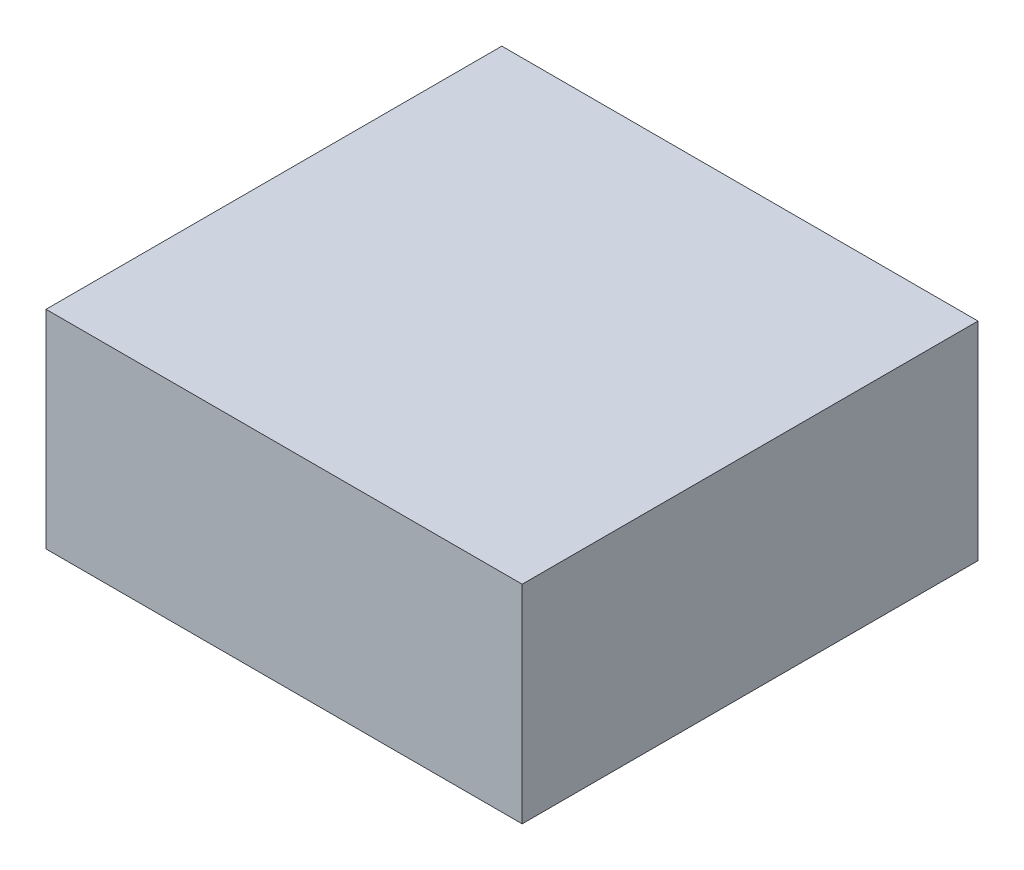
ISO-10303-21;
HEADER;
FILE_DESCRIPTION(('STEP AP214'),'2;1');
FILE_NAME('part.step','',(''),(''),'','','');
FILE_SCHEMA(('AUTOMOTIVE_DESIGN { 1 0 10303 214 1 1 1 1 }'));
ENDSEC;
DATA;
#1=APPLICATION_CONTEXT('core data for automotive mechanical design processes');
#2=APPLICATION_PROTOCOL_DEFINITION('international standard','automotive_design',2000,#1);
#3=PRODUCT_CONTEXT('',#1,'mechanical');
#4=PRODUCT('Part','Part','',(#3));
#5=PRODUCT_RELATED_PRODUCT_CATEGORY('part','',(#4));
#6=PRODUCT_DEFINITION_FORMATION('','',#4);
#7=PRODUCT_DEFINITION_CONTEXT('part definition',#1,'design');
#8=PRODUCT_DEFINITION('design','',#6,#7);
#9=PRODUCT_DEFINITION_SHAPE('','',#8);
#10=(LENGTH_UNIT() NAMED_UNIT(*) SI_UNIT(.MILLI.,.METRE.));
#11=(NAMED_UNIT(*) PLANE_ANGLE_UNIT() SI_UNIT($,.RADIAN.));
#12=(NAMED_UNIT(*) SI_UNIT($,.STERADIAN.) SOLID_ANGLE_UNIT());
#13=UNCERTAINTY_MEASURE_WITH_UNIT(LENGTH_MEASURE(1.E-05),#10,'distance_accuracy_value','');
#14=(GEOMETRIC_REPRESENTATION_CONTEXT(3) GLOBAL_UNCERTAINTY_ASSIGNED_CONTEXT((#13)) GLOBAL_UNIT_ASSIGNED_CONTEXT((#10,
#11,#12)) REPRESENTATION_CONTEXT('',''));
#15=CARTESIAN_POINT('',(0.,0.,0.));
#16=DIRECTION('',(0.,0.,1.));
#17=DIRECTION('',(1.,0.,0.));
#18=AXIS2_PLACEMENT_3D('',#15,#16,#17);
#19=CARTESIAN_POINT('',(58.5,-25.5,56.));
#20=DIRECTION('',(-1.,0.,0.));
#21=DIRECTION('',(0.,0.,1.));
#22=AXIS2_PLACEMENT_3D('',#19,#20,#21);
#23=PLANE('',#22);
#24=DIRECTION('',(0.,1.,0.));
#25=VECTOR('',#24,1.);
#26=CARTESIAN_POINT('',(58.5,-25.5,-56.));
#27=LINE('',#26,#25);
#28=CARTESIAN_POINT('',(58.5,-25.5,-56.));
#29=VERTEX_POINT('',#28);
#30=CARTESIAN_POINT('',(58.5,25.5,-56.));
#31=VERTEX_POINT('',#30);
#32=EDGE_CURVE('E96',#29,#31,#27,.T.);
#33=ORIENTED_EDGE('',*,*,#32,.T.);
#34=DIRECTION('',(0.,0.,-1.));
#35=VECTOR('',#34,1.);
#36=CARTESIAN_POINT('',(58.5,25.5,56.));
#37=LINE('',#36,#35);
#38=CARTESIAN_POINT('',(58.5,25.5,56.));
#39=VERTEX_POINT('',#38);
#40=EDGE_CURVE('E11',#39,#31,#37,.T.);
#41=ORIENTED_EDGE('',*,*,#40,.F.);
#42=DIRECTION('',(0.,1.,0.));
#43=VECTOR('',#42,1.);
#44=CARTESIAN_POINT('',(58.5,-25.5,56.));
#45=LINE('',#44,#43);
#46=CARTESIAN_POINT('',(58.5,-25.5,56.));
#47=VERTEX_POINT('',#46);
#48=EDGE_CURVE('E84',#47,#39,#45,.T.);
#49=ORIENTED_EDGE('',*,*,#48,.F.);
#50=DIRECTION('',(0.,0.,-1.));
#51=VECTOR('',#50,1.);
#52=CARTESIAN_POINT('',(58.5,-25.5,56.));
#53=LINE('',#52,#51);
#54=EDGE_CURVE('E92',#47,#29,#53,.T.);
#55=ORIENTED_EDGE('',*,*,#54,.T.);
#56=EDGE_LOOP('',(#33,#41,#49,#55));
#57=FACE_BOUND('',#56,.T.);
#58=ADVANCED_FACE('F33',(#57),#23,.F.);
#59=CARTESIAN_POINT('',(-58.5,25.5,56.));
#60=DIRECTION('',(0.,-1.,0.));
#61=DIRECTION('',(0.,0.,-1.));
#62=AXIS2_PLACEMENT_3D('',#59,#60,#61);
#63=PLANE('',#62);
#64=DIRECTION('',(-1.,0.,0.));
#65=VECTOR('',#64,1.);
#66=CARTESIAN_POINT('',(-58.5,25.5,-56.));
#67=LINE('',#66,#65);
#68=CARTESIAN_POINT('',(-58.5,25.5,-56.));
#69=VERTEX_POINT('',#68);
#70=EDGE_CURVE('E88',#31,#69,#67,.T.);
#71=ORIENTED_EDGE('',*,*,#70,.T.);
#72=DIRECTION('',(0.,0.,-1.));
#73=VECTOR('',#72,1.);
#74=CARTESIAN_POINT('',(-58.5,25.5,56.));
#75=LINE('',#74,#73);
#76=CARTESIAN_POINT('',(-58.5,25.5,56.));
#77=VERTEX_POINT('',#76);
#78=EDGE_CURVE('E41',#77,#69,#75,.T.);
#79=ORIENTED_EDGE('',*,*,#78,.F.);
#80=DIRECTION('',(-1.,0.,0.));
#81=VECTOR('',#80,1.);
#82=CARTESIAN_POINT('',(-58.5,25.5,56.));
#83=LINE('',#82,#81);
#84=EDGE_CURVE('E79',#39,#77,#83,.T.);
#85=ORIENTED_EDGE('',*,*,#84,.F.);
#86=ORIENTED_EDGE('',*,*,#40,.T.);
#87=EDGE_LOOP('',(#71,#79,#85,#86));
#88=FACE_BOUND('',#87,.T.);
#89=ADVANCED_FACE('F87',(#88),#63,.F.);
#90=CARTESIAN_POINT('',(-58.5,-25.5,56.));
#91=DIRECTION('',(1.,0.,0.));
#92=DIRECTION('',(0.,0.,-1.));
#93=AXIS2_PLACEMENT_3D('',#90,#91,#92);
#94=PLANE('',#93);
#95=DIRECTION('',(0.,-1.,0.));
#96=VECTOR('',#95,1.);
#97=CARTESIAN_POINT('',(-58.5,-25.5,-56.));
#98=LINE('',#97,#96);
#99=CARTESIAN_POINT('',(-58.5,-25.5,-56.));
#100=VERTEX_POINT('',#99);
#101=EDGE_CURVE('E66',#69,#100,#98,.T.);
#102=ORIENTED_EDGE('',*,*,#101,.T.);
#103=DIRECTION('',(0.,0.,-1.));
#104=VECTOR('',#103,1.);
#105=CARTESIAN_POINT('',(-58.5,-25.5,56.));
#106=LINE('',#105,#104);
#107=CARTESIAN_POINT('',(-58.5,-25.5,56.));
#108=VERTEX_POINT('',#107);
#109=EDGE_CURVE('E89',#108,#100,#106,.T.);
#110=ORIENTED_EDGE('',*,*,#109,.F.);
#111=DIRECTION('',(0.,-1.,0.));
#112=VECTOR('',#111,1.);
#113=CARTESIAN_POINT('',(-58.5,-25.5,56.));
#114=LINE('',#113,#112);
#115=EDGE_CURVE('E82',#77,#108,#114,.T.);
#116=ORIENTED_EDGE('',*,*,#115,.F.);
#117=ORIENTED_EDGE('',*,*,#78,.T.);
#118=EDGE_LOOP('',(#102,#110,#116,#117));
#119=FACE_BOUND('',#118,.T.);
#120=ADVANCED_FACE('F90',(#119),#94,.F.);
#121=CARTESIAN_POINT('',(-58.5,-25.5,56.));
#122=DIRECTION('',(0.,1.,0.));
#123=DIRECTION('',(0.,0.,1.));
#124=AXIS2_PLACEMENT_3D('',#121,#122,#123);
#125=PLANE('',#124);
#126=DIRECTION('',(1.,0.,0.));
#127=VECTOR('',#126,1.);
#128=CARTESIAN_POINT('',(-58.5,-25.5,-56.));
#129=LINE('',#128,#127);
#130=EDGE_CURVE('E72',#100,#29,#129,.T.);
#131=ORIENTED_EDGE('',*,*,#130,.T.);
#132=ORIENTED_EDGE('',*,*,#54,.F.);
#133=DIRECTION('',(1.,0.,0.));
#134=VECTOR('',#133,1.);
#135=CARTESIAN_POINT('',(-58.5,-25.5,56.));
#136=LINE('',#135,#134);
#137=EDGE_CURVE('E49',#108,#47,#136,.T.);
#138=ORIENTED_EDGE('',*,*,#137,.F.);
#139=ORIENTED_EDGE('',*,*,#109,.T.);
#140=EDGE_LOOP('',(#131,#132,#138,#139));
#141=FACE_BOUND('',#140,.T.);
#142=ADVANCED_FACE('F103',(#141),#125,.F.);
#143=CARTESIAN_POINT('',(0.,0.,56.));
#144=DIRECTION('',(0.,0.,-1.));
#145=DIRECTION('',(-1.,0.,0.));
#146=AXIS2_PLACEMENT_3D('',#143,#144,#145);
#147=PLANE('',#146);
#148=ORIENTED_EDGE('',*,*,#48,.T.);
#149=ORIENTED_EDGE('',*,*,#84,.T.);
#150=ORIENTED_EDGE('',*,*,#115,.T.);
#151=ORIENTED_EDGE('',*,*,#137,.T.);
#152=EDGE_LOOP('',(#148,#149,#150,#151));
#153=FACE_BOUND('',#152,.T.);
#154=ADVANCED_FACE('F80',(#153),#147,.F.);
#155=CARTESIAN_POINT('',(0.,0.,-56.));
#156=DIRECTION('',(0.,0.,-1.));
#157=DIRECTION('',(-1.,0.,0.));
#158=AXIS2_PLACEMENT_3D('',#155,#156,#157);
#159=PLANE('',#158);
#160=ORIENTED_EDGE('',*,*,#32,.F.);
#161=ORIENTED_EDGE('',*,*,#130,.F.);
#162=ORIENTED_EDGE('',*,*,#101,.F.);
#163=ORIENTED_EDGE('',*,*,#70,.F.);
#164=EDGE_LOOP('',(#160,#161,#162,#163));
#165=FACE_BOUND('',#164,.T.);
#166=ADVANCED_FACE('F106',(#165),#159,.T.);
#167=CLOSED_SHELL('',(#58,#89,#120,#142,#154,#166));
#168=MANIFOLD_SOLID_BREP('B2',#167);
#169=ADVANCED_BREP_SHAPE_REPRESENTATION('',(#18,#168),#14);
#170=SHAPE_DEFINITION_REPRESENTATION(#9,#169);
ENDSEC;
END-ISO-10303-21;
